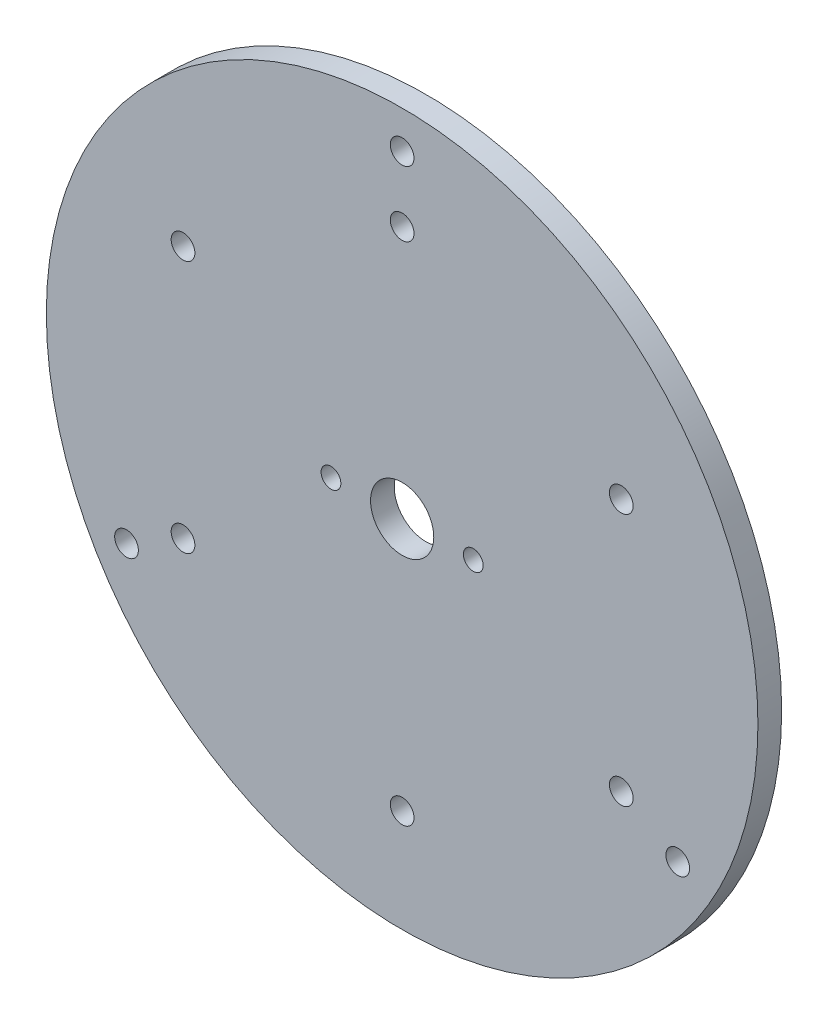
ISO-10303-21;
HEADER;
FILE_DESCRIPTION(('STEP AP214'),'2;1');
FILE_NAME('part.step','',(''),(''),'','','');
FILE_SCHEMA(('AUTOMOTIVE_DESIGN { 1 0 10303 214 1 1 1 1 }'));
ENDSEC;
DATA;
#1=APPLICATION_CONTEXT('core data for automotive mechanical design processes');
#2=APPLICATION_PROTOCOL_DEFINITION('international standard','automotive_design',2000,#1);
#3=PRODUCT_CONTEXT('',#1,'mechanical');
#4=PRODUCT('Part','Part','',(#3));
#5=PRODUCT_RELATED_PRODUCT_CATEGORY('part','',(#4));
#6=PRODUCT_DEFINITION_FORMATION('','',#4);
#7=PRODUCT_DEFINITION_CONTEXT('part definition',#1,'design');
#8=PRODUCT_DEFINITION('design','',#6,#7);
#9=PRODUCT_DEFINITION_SHAPE('','',#8);
#10=(LENGTH_UNIT() NAMED_UNIT(*) SI_UNIT(.MILLI.,.METRE.));
#11=(NAMED_UNIT(*) PLANE_ANGLE_UNIT() SI_UNIT($,.RADIAN.));
#12=(NAMED_UNIT(*) SI_UNIT($,.STERADIAN.) SOLID_ANGLE_UNIT());
#13=UNCERTAINTY_MEASURE_WITH_UNIT(LENGTH_MEASURE(1.E-05),#10,'distance_accuracy_value','');
#14=(GEOMETRIC_REPRESENTATION_CONTEXT(3) GLOBAL_UNCERTAINTY_ASSIGNED_CONTEXT((#13)) GLOBAL_UNIT_ASSIGNED_CONTEXT((#10,
#11,#12)) REPRESENTATION_CONTEXT('',''));
#15=CARTESIAN_POINT('',(0.,0.,0.));
#16=DIRECTION('',(0.,0.,1.));
#17=DIRECTION('',(1.,0.,0.));
#18=AXIS2_PLACEMENT_3D('',#15,#16,#17);
#19=CARTESIAN_POINT('',(0.,0.,3.));
#20=DIRECTION('',(0.,0.,-1.));
#21=DIRECTION('',(-1.,0.,0.));
#22=AXIS2_PLACEMENT_3D('',#19,#20,#21);
#23=CYLINDRICAL_SURFACE('',#22,4.);
#24=CARTESIAN_POINT('',(0.,0.,3.));
#25=DIRECTION('',(0.,0.,1.));
#26=DIRECTION('',(1.,0.,0.));
#27=AXIS2_PLACEMENT_3D('',#24,#25,#26);
#28=CIRCLE('',#27,4.);
#29=CARTESIAN_POINT('',(4.,0.,3.));
#30=VERTEX_POINT('',#29);
#31=EDGE_CURVE('E23',#30,#30,#28,.T.);
#32=ORIENTED_EDGE('',*,*,#31,.T.);
#33=EDGE_LOOP('',(#32));
#34=FACE_BOUND('',#33,.T.);
#35=CARTESIAN_POINT('',(0.,0.,0.));
#36=DIRECTION('',(0.,0.,1.));
#37=DIRECTION('',(1.,0.,0.));
#38=AXIS2_PLACEMENT_3D('',#35,#36,#37);
#39=CIRCLE('',#38,4.);
#40=CARTESIAN_POINT('',(4.,0.,0.));
#41=VERTEX_POINT('',#40);
#42=EDGE_CURVE('E64',#41,#41,#39,.T.);
#43=ORIENTED_EDGE('',*,*,#42,.F.);
#44=EDGE_LOOP('',(#43));
#45=FACE_BOUND('',#44,.T.);
#46=ADVANCED_FACE('F15',(#34,#45),#23,.F.);
#47=CARTESIAN_POINT('',(9.,0.,3.));
#48=DIRECTION('',(0.,0.,-1.));
#49=DIRECTION('',(-1.,0.,0.));
#50=AXIS2_PLACEMENT_3D('',#47,#48,#49);
#51=CYLINDRICAL_SURFACE('',#50,1.25);
#52=CARTESIAN_POINT('',(9.,0.,3.));
#53=DIRECTION('',(0.,0.,1.));
#54=DIRECTION('',(1.,0.,0.));
#55=AXIS2_PLACEMENT_3D('',#52,#53,#54);
#56=CIRCLE('',#55,1.25);
#57=CARTESIAN_POINT('',(10.25,0.,3.));
#58=VERTEX_POINT('',#57);
#59=EDGE_CURVE('E28',#58,#58,#56,.T.);
#60=ORIENTED_EDGE('',*,*,#59,.T.);
#61=EDGE_LOOP('',(#60));
#62=FACE_BOUND('',#61,.T.);
#63=CARTESIAN_POINT('',(9.,0.,0.));
#64=DIRECTION('',(0.,0.,1.));
#65=DIRECTION('',(1.,0.,0.));
#66=AXIS2_PLACEMENT_3D('',#63,#64,#65);
#67=CIRCLE('',#66,1.25);
#68=CARTESIAN_POINT('',(10.25,0.,0.));
#69=VERTEX_POINT('',#68);
#70=EDGE_CURVE('E62',#69,#69,#67,.T.);
#71=ORIENTED_EDGE('',*,*,#70,.F.);
#72=EDGE_LOOP('',(#71));
#73=FACE_BOUND('',#72,.T.);
#74=ADVANCED_FACE('F106',(#62,#73),#51,.F.);
#75=CARTESIAN_POINT('',(-9.,0.,3.));
#76=DIRECTION('',(0.,0.,-1.));
#77=DIRECTION('',(-1.,0.,0.));
#78=AXIS2_PLACEMENT_3D('',#75,#76,#77);
#79=CYLINDRICAL_SURFACE('',#78,1.25);
#80=CARTESIAN_POINT('',(-9.,0.,3.));
#81=DIRECTION('',(0.,0.,1.));
#82=DIRECTION('',(1.,0.,0.));
#83=AXIS2_PLACEMENT_3D('',#80,#81,#82);
#84=CIRCLE('',#83,1.25);
#85=CARTESIAN_POINT('',(-7.75,0.,3.));
#86=VERTEX_POINT('',#85);
#87=EDGE_CURVE('E101',#86,#86,#84,.T.);
#88=ORIENTED_EDGE('',*,*,#87,.T.);
#89=EDGE_LOOP('',(#88));
#90=FACE_BOUND('',#89,.T.);
#91=CARTESIAN_POINT('',(-9.,0.,0.));
#92=DIRECTION('',(0.,0.,1.));
#93=DIRECTION('',(1.,0.,0.));
#94=AXIS2_PLACEMENT_3D('',#91,#92,#93);
#95=CIRCLE('',#94,1.25);
#96=CARTESIAN_POINT('',(-7.75,0.,0.));
#97=VERTEX_POINT('',#96);
#98=EDGE_CURVE('E59',#97,#97,#95,.T.);
#99=ORIENTED_EDGE('',*,*,#98,.F.);
#100=EDGE_LOOP('',(#99));
#101=FACE_BOUND('',#100,.T.);
#102=ADVANCED_FACE('F126',(#90,#101),#79,.F.);
#103=CARTESIAN_POINT('',(0.,32.,3.));
#104=DIRECTION('',(0.,0.,-1.));
#105=DIRECTION('',(-1.,0.,0.));
#106=AXIS2_PLACEMENT_3D('',#103,#104,#105);
#107=CYLINDRICAL_SURFACE('',#106,1.5);
#108=CARTESIAN_POINT('',(0.,32.,3.));
#109=DIRECTION('',(0.,0.,1.));
#110=DIRECTION('',(1.,0.,0.));
#111=AXIS2_PLACEMENT_3D('',#108,#109,#110);
#112=CIRCLE('',#111,1.5);
#113=CARTESIAN_POINT('',(1.5,32.,3.));
#114=VERTEX_POINT('',#113);
#115=EDGE_CURVE('E98',#114,#114,#112,.T.);
#116=ORIENTED_EDGE('',*,*,#115,.T.);
#117=EDGE_LOOP('',(#116));
#118=FACE_BOUND('',#117,.T.);
#119=CARTESIAN_POINT('',(0.,32.,0.));
#120=DIRECTION('',(0.,0.,1.));
#121=DIRECTION('',(1.,0.,0.));
#122=AXIS2_PLACEMENT_3D('',#119,#120,#121);
#123=CIRCLE('',#122,1.5);
#124=CARTESIAN_POINT('',(1.5,32.,0.));
#125=VERTEX_POINT('',#124);
#126=EDGE_CURVE('E56',#125,#125,#123,.T.);
#127=ORIENTED_EDGE('',*,*,#126,.F.);
#128=EDGE_LOOP('',(#127));
#129=FACE_BOUND('',#128,.T.);
#130=ADVANCED_FACE('F133',(#118,#129),#107,.F.);
#131=CARTESIAN_POINT('',(0.,40.25,3.));
#132=DIRECTION('',(0.,0.,-1.));
#133=DIRECTION('',(-1.,0.,0.));
#134=AXIS2_PLACEMENT_3D('',#131,#132,#133);
#135=CYLINDRICAL_SURFACE('',#134,1.5);
#136=CARTESIAN_POINT('',(0.,40.25,3.));
#137=DIRECTION('',(0.,0.,1.));
#138=DIRECTION('',(1.,0.,0.));
#139=AXIS2_PLACEMENT_3D('',#136,#137,#138);
#140=CIRCLE('',#139,1.5);
#141=CARTESIAN_POINT('',(1.5,40.25,3.));
#142=VERTEX_POINT('',#141);
#143=EDGE_CURVE('E95',#142,#142,#140,.T.);
#144=ORIENTED_EDGE('',*,*,#143,.T.);
#145=EDGE_LOOP('',(#144));
#146=FACE_BOUND('',#145,.T.);
#147=CARTESIAN_POINT('',(0.,40.25,0.));
#148=DIRECTION('',(0.,0.,1.));
#149=DIRECTION('',(1.,0.,0.));
#150=AXIS2_PLACEMENT_3D('',#147,#148,#149);
#151=CIRCLE('',#150,1.5);
#152=CARTESIAN_POINT('',(1.5,40.25,0.));
#153=VERTEX_POINT('',#152);
#154=EDGE_CURVE('E53',#153,#153,#151,.T.);
#155=ORIENTED_EDGE('',*,*,#154,.F.);
#156=EDGE_LOOP('',(#155));
#157=FACE_BOUND('',#156,.T.);
#158=ADVANCED_FACE('F137',(#146,#157),#135,.F.);
#159=CARTESIAN_POINT('',(-34.8575225023186,-20.1250000000029,3.));
#160=DIRECTION('',(0.,0.,-1.));
#161=DIRECTION('',(-1.,0.,0.));
#162=AXIS2_PLACEMENT_3D('',#159,#160,#161);
#163=CYLINDRICAL_SURFACE('',#162,1.50000000000558);
#164=CARTESIAN_POINT('',(-34.8575225023186,-20.1250000000029,3.));
#165=DIRECTION('',(0.,0.,1.));
#166=DIRECTION('',(1.,0.,0.));
#167=AXIS2_PLACEMENT_3D('',#164,#165,#166);
#168=CIRCLE('',#167,1.50000000000558);
#169=CARTESIAN_POINT('',(-33.357522502313,-20.1250000000029,3.));
#170=VERTEX_POINT('',#169);
#171=EDGE_CURVE('E92',#170,#170,#168,.T.);
#172=ORIENTED_EDGE('',*,*,#171,.T.);
#173=EDGE_LOOP('',(#172));
#174=FACE_BOUND('',#173,.T.);
#175=CARTESIAN_POINT('',(-34.8575225023186,-20.1250000000029,0.));
#176=DIRECTION('',(0.,0.,1.));
#177=DIRECTION('',(1.,0.,0.));
#178=AXIS2_PLACEMENT_3D('',#175,#176,#177);
#179=CIRCLE('',#178,1.50000000000558);
#180=CARTESIAN_POINT('',(-33.357522502313,-20.1250000000029,0.));
#181=VERTEX_POINT('',#180);
#182=EDGE_CURVE('E50',#181,#181,#179,.T.);
#183=ORIENTED_EDGE('',*,*,#182,.F.);
#184=EDGE_LOOP('',(#183));
#185=FACE_BOUND('',#184,.T.);
#186=ADVANCED_FACE('F141',(#174,#185),#163,.F.);
#187=CARTESIAN_POINT('',(34.8575225023288,-20.124999999997,3.));
#188=DIRECTION('',(0.,0.,-1.));
#189=DIRECTION('',(-1.,0.,0.));
#190=AXIS2_PLACEMENT_3D('',#187,#188,#189);
#191=CYLINDRICAL_SURFACE('',#190,1.50000000000367);
#192=CARTESIAN_POINT('',(34.8575225023288,-20.124999999997,3.));
#193=DIRECTION('',(0.,0.,1.));
#194=DIRECTION('',(1.,0.,0.));
#195=AXIS2_PLACEMENT_3D('',#192,#193,#194);
#196=CIRCLE('',#195,1.50000000000367);
#197=CARTESIAN_POINT('',(36.3575225023325,-20.124999999997,3.));
#198=VERTEX_POINT('',#197);
#199=EDGE_CURVE('E89',#198,#198,#196,.T.);
#200=ORIENTED_EDGE('',*,*,#199,.T.);
#201=EDGE_LOOP('',(#200));
#202=FACE_BOUND('',#201,.T.);
#203=CARTESIAN_POINT('',(34.8575225023288,-20.124999999997,0.));
#204=DIRECTION('',(0.,0.,1.));
#205=DIRECTION('',(1.,0.,0.));
#206=AXIS2_PLACEMENT_3D('',#203,#204,#205);
#207=CIRCLE('',#206,1.50000000000367);
#208=CARTESIAN_POINT('',(36.3575225023325,-20.124999999997,0.));
#209=VERTEX_POINT('',#208);
#210=EDGE_CURVE('E47',#209,#209,#207,.T.);
#211=ORIENTED_EDGE('',*,*,#210,.F.);
#212=EDGE_LOOP('',(#211));
#213=FACE_BOUND('',#212,.T.);
#214=ADVANCED_FACE('F145',(#202,#213),#191,.F.);
#215=CARTESIAN_POINT('',(27.7128129211027,16.0000000000012,3.));
#216=DIRECTION('',(0.,0.,-1.));
#217=DIRECTION('',(-1.,0.,0.));
#218=AXIS2_PLACEMENT_3D('',#215,#216,#217);
#219=CYLINDRICAL_SURFACE('',#218,1.50000000000039);
#220=CARTESIAN_POINT('',(27.7128129211027,16.0000000000012,3.));
#221=DIRECTION('',(0.,0.,1.));
#222=DIRECTION('',(1.,0.,0.));
#223=AXIS2_PLACEMENT_3D('',#220,#221,#222);
#224=CIRCLE('',#223,1.50000000000039);
#225=CARTESIAN_POINT('',(29.2128129211031,16.0000000000012,3.));
#226=VERTEX_POINT('',#225);
#227=EDGE_CURVE('E86',#226,#226,#224,.T.);
#228=ORIENTED_EDGE('',*,*,#227,.T.);
#229=EDGE_LOOP('',(#228));
#230=FACE_BOUND('',#229,.T.);
#231=CARTESIAN_POINT('',(27.7128129211027,16.0000000000012,0.));
#232=DIRECTION('',(0.,0.,1.));
#233=DIRECTION('',(1.,0.,0.));
#234=AXIS2_PLACEMENT_3D('',#231,#232,#233);
#235=CIRCLE('',#234,1.50000000000039);
#236=CARTESIAN_POINT('',(29.2128129211031,16.0000000000012,0.));
#237=VERTEX_POINT('',#236);
#238=EDGE_CURVE('E44',#237,#237,#235,.T.);
#239=ORIENTED_EDGE('',*,*,#238,.F.);
#240=EDGE_LOOP('',(#239));
#241=FACE_BOUND('',#240,.T.);
#242=ADVANCED_FACE('F149',(#230,#241),#219,.F.);
#243=CARTESIAN_POINT('',(27.7128129211041,-15.9999999999988,3.));
#244=DIRECTION('',(0.,0.,-1.));
#245=DIRECTION('',(-1.,0.,0.));
#246=AXIS2_PLACEMENT_3D('',#243,#244,#245);
#247=CYLINDRICAL_SURFACE('',#246,1.50000000000175);
#248=CARTESIAN_POINT('',(27.7128129211041,-15.9999999999988,3.));
#249=DIRECTION('',(0.,0.,1.));
#250=DIRECTION('',(1.,0.,0.));
#251=AXIS2_PLACEMENT_3D('',#248,#249,#250);
#252=CIRCLE('',#251,1.50000000000175);
#253=CARTESIAN_POINT('',(29.2128129211059,-15.9999999999988,3.));
#254=VERTEX_POINT('',#253);
#255=EDGE_CURVE('E83',#254,#254,#252,.T.);
#256=ORIENTED_EDGE('',*,*,#255,.T.);
#257=EDGE_LOOP('',(#256));
#258=FACE_BOUND('',#257,.T.);
#259=CARTESIAN_POINT('',(27.7128129211041,-15.9999999999988,0.));
#260=DIRECTION('',(0.,0.,1.));
#261=DIRECTION('',(1.,0.,0.));
#262=AXIS2_PLACEMENT_3D('',#259,#260,#261);
#263=CIRCLE('',#262,1.50000000000175);
#264=CARTESIAN_POINT('',(29.2128129211059,-15.9999999999988,0.));
#265=VERTEX_POINT('',#264);
#266=EDGE_CURVE('E41',#265,#265,#263,.T.);
#267=ORIENTED_EDGE('',*,*,#266,.F.);
#268=EDGE_LOOP('',(#267));
#269=FACE_BOUND('',#268,.T.);
#270=ADVANCED_FACE('F153',(#258,#269),#247,.F.);
#271=CARTESIAN_POINT('',(2.71440066712859E-12,-32.,3.));
#272=DIRECTION('',(0.,0.,-1.));
#273=DIRECTION('',(-1.,0.,0.));
#274=AXIS2_PLACEMENT_3D('',#271,#272,#273);
#275=CYLINDRICAL_SURFACE('',#274,1.50000000000281);
#276=CARTESIAN_POINT('',(2.71440066712859E-12,-32.,3.));
#277=DIRECTION('',(0.,0.,1.));
#278=DIRECTION('',(1.,0.,0.));
#279=AXIS2_PLACEMENT_3D('',#276,#277,#278);
#280=CIRCLE('',#279,1.50000000000281);
#281=CARTESIAN_POINT('',(1.50000000000552,-32.,3.));
#282=VERTEX_POINT('',#281);
#283=EDGE_CURVE('E78',#282,#282,#280,.T.);
#284=ORIENTED_EDGE('',*,*,#283,.T.);
#285=EDGE_LOOP('',(#284));
#286=FACE_BOUND('',#285,.T.);
#287=CARTESIAN_POINT('',(2.71440066712859E-12,-32.,0.));
#288=DIRECTION('',(0.,0.,1.));
#289=DIRECTION('',(1.,0.,0.));
#290=AXIS2_PLACEMENT_3D('',#287,#288,#289);
#291=CIRCLE('',#290,1.50000000000281);
#292=CARTESIAN_POINT('',(1.50000000000552,-32.,0.));
#293=VERTEX_POINT('',#292);
#294=EDGE_CURVE('E38',#293,#293,#291,.T.);
#295=ORIENTED_EDGE('',*,*,#294,.F.);
#296=EDGE_LOOP('',(#295));
#297=FACE_BOUND('',#296,.T.);
#298=ADVANCED_FACE('F157',(#286,#297),#275,.F.);
#299=CARTESIAN_POINT('',(-27.7128129211,-16.0000000000012,3.));
#300=DIRECTION('',(0.,0.,-1.));
#301=DIRECTION('',(-1.,0.,0.));
#302=AXIS2_PLACEMENT_3D('',#299,#300,#301);
#303=CYLINDRICAL_SURFACE('',#302,1.50000000000258);
#304=CARTESIAN_POINT('',(-27.7128129211,-16.0000000000012,3.));
#305=DIRECTION('',(0.,0.,1.));
#306=DIRECTION('',(1.,0.,0.));
#307=AXIS2_PLACEMENT_3D('',#304,#305,#306);
#308=CIRCLE('',#307,1.50000000000258);
#309=CARTESIAN_POINT('',(-26.2128129210974,-16.0000000000012,3.));
#310=VERTEX_POINT('',#309);
#311=EDGE_CURVE('E73',#310,#310,#308,.T.);
#312=ORIENTED_EDGE('',*,*,#311,.T.);
#313=EDGE_LOOP('',(#312));
#314=FACE_BOUND('',#313,.T.);
#315=CARTESIAN_POINT('',(-27.7128129211,-16.0000000000012,0.));
#316=DIRECTION('',(0.,0.,1.));
#317=DIRECTION('',(1.,0.,0.));
#318=AXIS2_PLACEMENT_3D('',#315,#316,#317);
#319=CIRCLE('',#318,1.50000000000258);
#320=CARTESIAN_POINT('',(-26.2128129210974,-16.0000000000012,0.));
#321=VERTEX_POINT('',#320);
#322=EDGE_CURVE('E35',#321,#321,#319,.T.);
#323=ORIENTED_EDGE('',*,*,#322,.F.);
#324=EDGE_LOOP('',(#323));
#325=FACE_BOUND('',#324,.T.);
#326=ADVANCED_FACE('F160',(#314,#325),#303,.F.);
#327=CARTESIAN_POINT('',(-27.7128129211014,15.9999999999988,3.));
#328=DIRECTION('',(0.,0.,-1.));
#329=DIRECTION('',(-1.,0.,0.));
#330=AXIS2_PLACEMENT_3D('',#327,#328,#329);
#331=CYLINDRICAL_SURFACE('',#330,1.50000000000137);
#332=CARTESIAN_POINT('',(-27.7128129211014,15.9999999999988,3.));
#333=DIRECTION('',(0.,0.,1.));
#334=DIRECTION('',(1.,0.,0.));
#335=AXIS2_PLACEMENT_3D('',#332,#333,#334);
#336=CIRCLE('',#335,1.50000000000137);
#337=CARTESIAN_POINT('',(-26.2128129211,15.9999999999988,3.));
#338=VERTEX_POINT('',#337);
#339=EDGE_CURVE('E69',#338,#338,#336,.T.);
#340=ORIENTED_EDGE('',*,*,#339,.T.);
#341=EDGE_LOOP('',(#340));
#342=FACE_BOUND('',#341,.T.);
#343=CARTESIAN_POINT('',(-27.7128129211014,15.9999999999988,0.));
#344=DIRECTION('',(0.,0.,1.));
#345=DIRECTION('',(1.,0.,0.));
#346=AXIS2_PLACEMENT_3D('',#343,#344,#345);
#347=CIRCLE('',#346,1.50000000000137);
#348=CARTESIAN_POINT('',(-26.2128129211,15.9999999999988,0.));
#349=VERTEX_POINT('',#348);
#350=EDGE_CURVE('E32',#349,#349,#347,.T.);
#351=ORIENTED_EDGE('',*,*,#350,.F.);
#352=EDGE_LOOP('',(#351));
#353=FACE_BOUND('',#352,.T.);
#354=ADVANCED_FACE('F17',(#342,#353),#331,.F.);
#355=CARTESIAN_POINT('',(0.,0.,3.));
#356=DIRECTION('',(0.,0.,-1.));
#357=DIRECTION('',(-1.,0.,0.));
#358=AXIS2_PLACEMENT_3D('',#355,#356,#357);
#359=CYLINDRICAL_SURFACE('',#358,45.);
#360=CARTESIAN_POINT('',(0.,0.,3.));
#361=DIRECTION('',(0.,0.,1.));
#362=DIRECTION('',(1.,0.,0.));
#363=AXIS2_PLACEMENT_3D('',#360,#361,#362);
#364=CIRCLE('',#363,45.);
#365=CARTESIAN_POINT('',(45.,0.,3.));
#366=VERTEX_POINT('',#365);
#367=EDGE_CURVE('E10',#366,#366,#364,.T.);
#368=ORIENTED_EDGE('',*,*,#367,.F.);
#369=EDGE_LOOP('',(#368));
#370=FACE_BOUND('',#369,.T.);
#371=CARTESIAN_POINT('',(0.,0.,0.));
#372=DIRECTION('',(0.,0.,1.));
#373=DIRECTION('',(1.,0.,0.));
#374=AXIS2_PLACEMENT_3D('',#371,#372,#373);
#375=CIRCLE('',#374,45.);
#376=CARTESIAN_POINT('',(45.,0.,0.));
#377=VERTEX_POINT('',#376);
#378=EDGE_CURVE('E19',#377,#377,#375,.T.);
#379=ORIENTED_EDGE('',*,*,#378,.T.);
#380=EDGE_LOOP('',(#379));
#381=FACE_BOUND('',#380,.T.);
#382=ADVANCED_FACE('F113',(#370,#381),#359,.T.);
#383=CARTESIAN_POINT('',(0.,0.,3.));
#384=DIRECTION('',(0.,0.,1.));
#385=DIRECTION('',(1.,0.,0.));
#386=AXIS2_PLACEMENT_3D('',#383,#384,#385);
#387=PLANE('',#386);
#388=ORIENTED_EDGE('',*,*,#339,.F.);
#389=EDGE_LOOP('',(#388));
#390=FACE_BOUND('',#389,.T.);
#391=ORIENTED_EDGE('',*,*,#311,.F.);
#392=EDGE_LOOP('',(#391));
#393=FACE_BOUND('',#392,.T.);
#394=ORIENTED_EDGE('',*,*,#283,.F.);
#395=EDGE_LOOP('',(#394));
#396=FACE_BOUND('',#395,.T.);
#397=ORIENTED_EDGE('',*,*,#255,.F.);
#398=EDGE_LOOP('',(#397));
#399=FACE_BOUND('',#398,.T.);
#400=ORIENTED_EDGE('',*,*,#227,.F.);
#401=EDGE_LOOP('',(#400));
#402=FACE_BOUND('',#401,.T.);
#403=ORIENTED_EDGE('',*,*,#199,.F.);
#404=EDGE_LOOP('',(#403));
#405=FACE_BOUND('',#404,.T.);
#406=ORIENTED_EDGE('',*,*,#171,.F.);
#407=EDGE_LOOP('',(#406));
#408=FACE_BOUND('',#407,.T.);
#409=ORIENTED_EDGE('',*,*,#143,.F.);
#410=EDGE_LOOP('',(#409));
#411=FACE_BOUND('',#410,.T.);
#412=ORIENTED_EDGE('',*,*,#115,.F.);
#413=EDGE_LOOP('',(#412));
#414=FACE_BOUND('',#413,.T.);
#415=ORIENTED_EDGE('',*,*,#87,.F.);
#416=EDGE_LOOP('',(#415));
#417=FACE_BOUND('',#416,.T.);
#418=ORIENTED_EDGE('',*,*,#59,.F.);
#419=EDGE_LOOP('',(#418));
#420=FACE_BOUND('',#419,.T.);
#421=ORIENTED_EDGE('',*,*,#31,.F.);
#422=EDGE_LOOP('',(#421));
#423=FACE_BOUND('',#422,.T.);
#424=ORIENTED_EDGE('',*,*,#367,.T.);
#425=EDGE_LOOP('',(#424));
#426=FACE_BOUND('',#425,.T.);
#427=ADVANCED_FACE('F109',(#390,#393,#396,#399,#402,#405,#408,#411,#414,#417,#420,#423,#426),
#387,.T.);
#428=CARTESIAN_POINT('',(0.,0.,0.));
#429=DIRECTION('',(0.,0.,1.));
#430=DIRECTION('',(1.,0.,0.));
#431=AXIS2_PLACEMENT_3D('',#428,#429,#430);
#432=PLANE('',#431);
#433=ORIENTED_EDGE('',*,*,#350,.T.);
#434=EDGE_LOOP('',(#433));
#435=FACE_BOUND('',#434,.T.);
#436=ORIENTED_EDGE('',*,*,#322,.T.);
#437=EDGE_LOOP('',(#436));
#438=FACE_BOUND('',#437,.T.);
#439=ORIENTED_EDGE('',*,*,#294,.T.);
#440=EDGE_LOOP('',(#439));
#441=FACE_BOUND('',#440,.T.);
#442=ORIENTED_EDGE('',*,*,#266,.T.);
#443=EDGE_LOOP('',(#442));
#444=FACE_BOUND('',#443,.T.);
#445=ORIENTED_EDGE('',*,*,#238,.T.);
#446=EDGE_LOOP('',(#445));
#447=FACE_BOUND('',#446,.T.);
#448=ORIENTED_EDGE('',*,*,#210,.T.);
#449=EDGE_LOOP('',(#448));
#450=FACE_BOUND('',#449,.T.);
#451=ORIENTED_EDGE('',*,*,#182,.T.);
#452=EDGE_LOOP('',(#451));
#453=FACE_BOUND('',#452,.T.);
#454=ORIENTED_EDGE('',*,*,#154,.T.);
#455=EDGE_LOOP('',(#454));
#456=FACE_BOUND('',#455,.T.);
#457=ORIENTED_EDGE('',*,*,#126,.T.);
#458=EDGE_LOOP('',(#457));
#459=FACE_BOUND('',#458,.T.);
#460=ORIENTED_EDGE('',*,*,#98,.T.);
#461=EDGE_LOOP('',(#460));
#462=FACE_BOUND('',#461,.T.);
#463=ORIENTED_EDGE('',*,*,#70,.T.);
#464=EDGE_LOOP('',(#463));
#465=FACE_BOUND('',#464,.T.);
#466=ORIENTED_EDGE('',*,*,#42,.T.);
#467=EDGE_LOOP('',(#466));
#468=FACE_BOUND('',#467,.T.);
#469=ORIENTED_EDGE('',*,*,#378,.F.);
#470=EDGE_LOOP('',(#469));
#471=FACE_BOUND('',#470,.T.);
#472=ADVANCED_FACE('F112',(#435,#438,#441,#444,#447,#450,#453,#456,#459,#462,#465,#468,#471),
#432,.F.);
#473=CLOSED_SHELL('',(#46,#74,#102,#130,#158,#186,#214,#242,#270,#298,#326,#354,#382,#427,#472));
#474=MANIFOLD_SOLID_BREP('B1',#473);
#475=ADVANCED_BREP_SHAPE_REPRESENTATION('',(#18,#474),#14);
#476=SHAPE_DEFINITION_REPRESENTATION(#9,#475);
ENDSEC;
END-ISO-10303-21;
